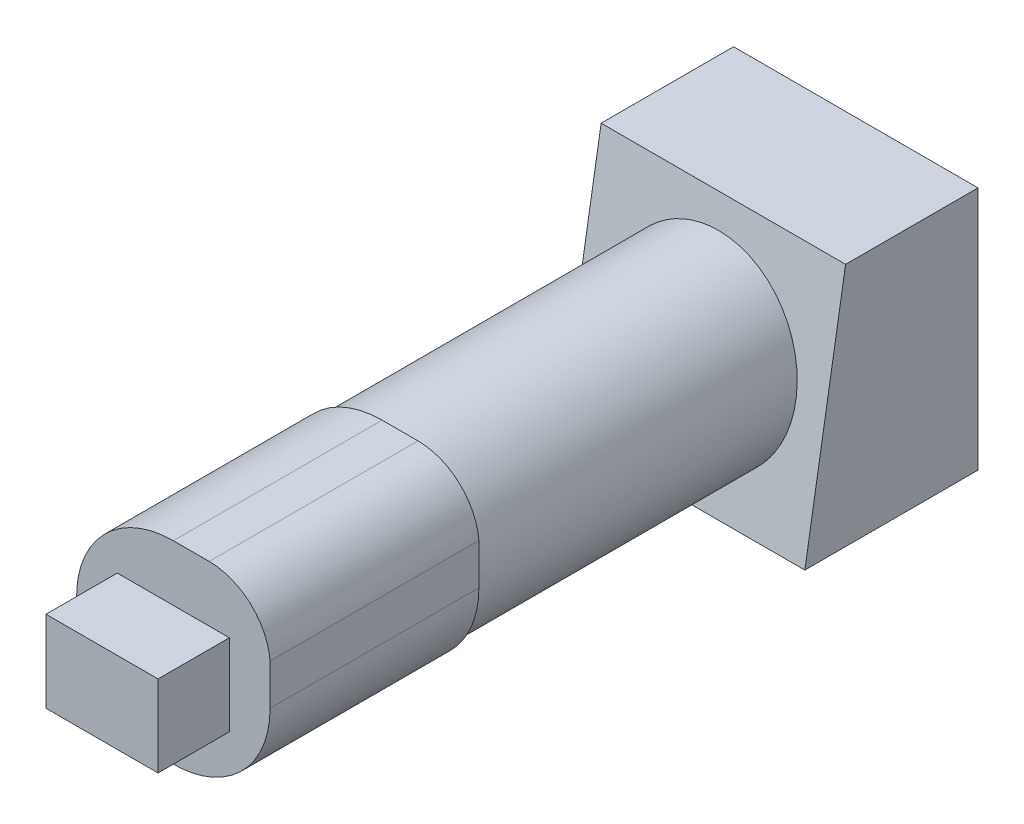
ISO-10303-21;
HEADER;
FILE_DESCRIPTION(('STEP AP214'),'2;1');
FILE_NAME('part.step','',(''),(''),'','','');
FILE_SCHEMA(('AUTOMOTIVE_DESIGN { 1 0 10303 214 1 1 1 1 }'));
ENDSEC;
DATA;
#1=APPLICATION_CONTEXT('core data for automotive mechanical design processes');
#2=APPLICATION_PROTOCOL_DEFINITION('international standard','automotive_design',2000,#1);
#3=PRODUCT_CONTEXT('',#1,'mechanical');
#4=PRODUCT('Part','Part','',(#3));
#5=PRODUCT_RELATED_PRODUCT_CATEGORY('part','',(#4));
#6=PRODUCT_DEFINITION_FORMATION('','',#4);
#7=PRODUCT_DEFINITION_CONTEXT('part definition',#1,'design');
#8=PRODUCT_DEFINITION('design','',#6,#7);
#9=PRODUCT_DEFINITION_SHAPE('','',#8);
#10=(LENGTH_UNIT() NAMED_UNIT(*) SI_UNIT(.MILLI.,.METRE.));
#11=(NAMED_UNIT(*) PLANE_ANGLE_UNIT() SI_UNIT($,.RADIAN.));
#12=(NAMED_UNIT(*) SI_UNIT($,.STERADIAN.) SOLID_ANGLE_UNIT());
#13=UNCERTAINTY_MEASURE_WITH_UNIT(LENGTH_MEASURE(1.E-05),#10,'distance_accuracy_value','');
#14=(GEOMETRIC_REPRESENTATION_CONTEXT(3) GLOBAL_UNCERTAINTY_ASSIGNED_CONTEXT((#13)) GLOBAL_UNIT_ASSIGNED_CONTEXT((#10,
#11,#12)) REPRESENTATION_CONTEXT('',''));
#15=CARTESIAN_POINT('',(0.,0.,0.));
#16=DIRECTION('',(0.,0.,1.));
#17=DIRECTION('',(1.,0.,0.));
#18=AXIS2_PLACEMENT_3D('',#15,#16,#17);
#19=CARTESIAN_POINT('',(12.,24.,8.5));
#20=DIRECTION('',(-1.,0.,0.));
#21=DIRECTION('',(0.,0.,1.));
#22=AXIS2_PLACEMENT_3D('',#19,#20,#21);
#23=PLANE('',#22);
#24=DIRECTION('',(0.,0.,-1.));
#25=VECTOR('',#24,1.);
#26=CARTESIAN_POINT('',(12.,24.,8.5));
#27=LINE('',#26,#25);
#28=CARTESIAN_POINT('',(12.,24.,4.50013871511284));
#29=VERTEX_POINT('',#28);
#30=CARTESIAN_POINT('',(12.,24.,-8.5));
#31=VERTEX_POINT('',#30);
#32=EDGE_CURVE('E190',#29,#31,#27,.T.);
#33=ORIENTED_EDGE('',*,*,#32,.F.);
#34=DIRECTION('',(0.,0.9863948483292,-0.164393440226838));
#35=VECTOR('',#34,1.);
#36=CARTESIAN_POINT('',(12.,0.,8.5));
#37=LINE('',#36,#35);
#38=CARTESIAN_POINT('',(12.,0.,8.5));
#39=VERTEX_POINT('',#38);
#40=EDGE_CURVE('E185',#39,#29,#37,.T.);
#41=ORIENTED_EDGE('',*,*,#40,.F.);
#42=DIRECTION('',(0.,0.,-1.));
#43=VECTOR('',#42,1.);
#44=CARTESIAN_POINT('',(12.,0.,8.5));
#45=LINE('',#44,#43);
#46=CARTESIAN_POINT('',(12.,0.,-8.5));
#47=VERTEX_POINT('',#46);
#48=EDGE_CURVE('E189',#39,#47,#45,.T.);
#49=ORIENTED_EDGE('',*,*,#48,.T.);
#50=DIRECTION('',(0.,-1.,0.));
#51=VECTOR('',#50,1.);
#52=CARTESIAN_POINT('',(12.,24.,-8.5));
#53=LINE('',#52,#51);
#54=EDGE_CURVE('E11',#31,#47,#53,.T.);
#55=ORIENTED_EDGE('',*,*,#54,.F.);
#56=EDGE_LOOP('',(#33,#41,#49,#55));
#57=FACE_BOUND('',#56,.T.);
#58=ADVANCED_FACE('F34',(#57),#23,.F.);
#59=CARTESIAN_POINT('',(-12.,24.,-8.5));
#60=DIRECTION('',(0.,0.,1.));
#61=DIRECTION('',(1.,0.,0.));
#62=AXIS2_PLACEMENT_3D('',#59,#60,#61);
#63=PLANE('',#62);
#64=DIRECTION('',(-1.,0.,0.));
#65=VECTOR('',#64,1.);
#66=CARTESIAN_POINT('',(-12.,0.,-8.5));
#67=LINE('',#66,#65);
#68=CARTESIAN_POINT('',(-12.,0.,-8.5));
#69=VERTEX_POINT('',#68);
#70=EDGE_CURVE('E200',#47,#69,#67,.T.);
#71=ORIENTED_EDGE('',*,*,#70,.T.);
#72=DIRECTION('',(0.,-1.,0.));
#73=VECTOR('',#72,1.);
#74=CARTESIAN_POINT('',(-12.,24.,-8.5));
#75=LINE('',#74,#73);
#76=CARTESIAN_POINT('',(-12.,24.,-8.5));
#77=VERTEX_POINT('',#76);
#78=EDGE_CURVE('E42',#77,#69,#75,.T.);
#79=ORIENTED_EDGE('',*,*,#78,.F.);
#80=DIRECTION('',(-1.,0.,0.));
#81=VECTOR('',#80,1.);
#82=CARTESIAN_POINT('',(-12.,24.,-8.5));
#83=LINE('',#82,#81);
#84=EDGE_CURVE('E192',#31,#77,#83,.T.);
#85=ORIENTED_EDGE('',*,*,#84,.F.);
#86=ORIENTED_EDGE('',*,*,#54,.T.);
#87=EDGE_LOOP('',(#71,#79,#85,#86));
#88=FACE_BOUND('',#87,.T.);
#89=ADVANCED_FACE('F226',(#88),#63,.F.);
#90=CARTESIAN_POINT('',(-12.,24.,8.5));
#91=DIRECTION('',(1.,0.,0.));
#92=DIRECTION('',(0.,0.,-1.));
#93=AXIS2_PLACEMENT_3D('',#90,#91,#92);
#94=PLANE('',#93);
#95=DIRECTION('',(0.,0.,1.));
#96=VECTOR('',#95,1.);
#97=CARTESIAN_POINT('',(-12.,0.,8.5));
#98=LINE('',#97,#96);
#99=CARTESIAN_POINT('',(-12.,0.,8.5));
#100=VERTEX_POINT('',#99);
#101=EDGE_CURVE('E202',#69,#100,#98,.T.);
#102=ORIENTED_EDGE('',*,*,#101,.T.);
#103=DIRECTION('',(0.,0.9863948483292,-0.164393440226838));
#104=VECTOR('',#103,1.);
#105=CARTESIAN_POINT('',(-12.,0.,8.5));
#106=LINE('',#105,#104);
#107=CARTESIAN_POINT('',(-12.,24.,4.50013871511284));
#108=VERTEX_POINT('',#107);
#109=EDGE_CURVE('E181',#100,#108,#106,.T.);
#110=ORIENTED_EDGE('',*,*,#109,.T.);
#111=DIRECTION('',(0.,0.,1.));
#112=VECTOR('',#111,1.);
#113=CARTESIAN_POINT('',(-12.,24.,8.5));
#114=LINE('',#113,#112);
#115=EDGE_CURVE('E195',#77,#108,#114,.T.);
#116=ORIENTED_EDGE('',*,*,#115,.F.);
#117=ORIENTED_EDGE('',*,*,#78,.T.);
#118=EDGE_LOOP('',(#102,#110,#116,#117));
#119=FACE_BOUND('',#118,.T.);
#120=ADVANCED_FACE('F211',(#119),#94,.F.);
#121=CARTESIAN_POINT('',(0.,24.,0.));
#122=DIRECTION('',(0.,-1.,0.));
#123=DIRECTION('',(0.,0.,-1.));
#124=AXIS2_PLACEMENT_3D('',#121,#122,#123);
#125=PLANE('',#124);
#126=ORIENTED_EDGE('',*,*,#115,.T.);
#127=DIRECTION('',(1.,0.,0.));
#128=VECTOR('',#127,1.);
#129=CARTESIAN_POINT('',(-12.,24.,4.50013871511284));
#130=LINE('',#129,#128);
#131=EDGE_CURVE('E184',#108,#29,#130,.T.);
#132=ORIENTED_EDGE('',*,*,#131,.T.);
#133=ORIENTED_EDGE('',*,*,#32,.T.);
#134=ORIENTED_EDGE('',*,*,#84,.T.);
#135=EDGE_LOOP('',(#126,#132,#133,#134));
#136=FACE_BOUND('',#135,.T.);
#137=ADVANCED_FACE('F225',(#136),#125,.F.);
#138=CARTESIAN_POINT('',(0.,0.,0.));
#139=DIRECTION('',(0.,-1.,0.));
#140=DIRECTION('',(0.,0.,-1.));
#141=AXIS2_PLACEMENT_3D('',#138,#139,#140);
#142=PLANE('',#141);
#143=CARTESIAN_POINT('',(-4.99999999999999,0.,3.5));
#144=DIRECTION('',(0.,-1.,0.));
#145=DIRECTION('',(0.,0.,-1.));
#146=AXIS2_PLACEMENT_3D('',#143,#144,#145);
#147=CIRCLE('',#146,2.05);
#148=CARTESIAN_POINT('',(-4.99999999999999,0.,1.45));
#149=VERTEX_POINT('',#148);
#150=EDGE_CURVE('E303',#149,#149,#147,.T.);
#151=ORIENTED_EDGE('',*,*,#150,.F.);
#152=EDGE_LOOP('',(#151));
#153=FACE_BOUND('',#152,.T.);
#154=CARTESIAN_POINT('',(5.00000000000001,0.,3.5));
#155=DIRECTION('',(0.,-1.,0.));
#156=DIRECTION('',(0.,0.,-1.));
#157=AXIS2_PLACEMENT_3D('',#154,#155,#156);
#158=CIRCLE('',#157,2.05);
#159=CARTESIAN_POINT('',(5.00000000000001,0.,1.45));
#160=VERTEX_POINT('',#159);
#161=EDGE_CURVE('E313',#160,#160,#158,.T.);
#162=ORIENTED_EDGE('',*,*,#161,.F.);
#163=EDGE_LOOP('',(#162));
#164=FACE_BOUND('',#163,.T.);
#165=ORIENTED_EDGE('',*,*,#48,.F.);
#166=DIRECTION('',(1.,0.,0.));
#167=VECTOR('',#166,1.);
#168=CARTESIAN_POINT('',(-12.,0.,8.5));
#169=LINE('',#168,#167);
#170=EDGE_CURVE('E193',#100,#39,#169,.T.);
#171=ORIENTED_EDGE('',*,*,#170,.F.);
#172=ORIENTED_EDGE('',*,*,#101,.F.);
#173=ORIENTED_EDGE('',*,*,#70,.F.);
#174=EDGE_LOOP('',(#165,#171,#172,#173));
#175=FACE_BOUND('',#174,.T.);
#176=ADVANCED_FACE('F217',(#153,#164,#175),#142,.T.);
#177=CARTESIAN_POINT('',(-12.,0.,8.5));
#178=DIRECTION('',(0.,-0.164393440226838,-0.9863948483292));
#179=DIRECTION('',(0.,0.9863948483292,-0.164393440226838));
#180=AXIS2_PLACEMENT_3D('',#177,#178,#179);
#181=PLANE('',#180);
#182=CARTESIAN_POINT('',(0.,12.,6.50006935755642));
#183=DIRECTION('',(0.,-0.164393440226838,-0.9863948483292));
#184=DIRECTION('',(0.,0.9863948483292,-0.164393440226838));
#185=AXIS2_PLACEMENT_3D('',#182,#183,#184);
#186=ELLIPSE('',#185,9.25085934446671,9.125);
#187=CARTESIAN_POINT('',(0.,21.125,4.97928876486495));
#188=VERTEX_POINT('',#187);
#189=EDGE_CURVE('E37',#188,#188,#186,.T.);
#190=ORIENTED_EDGE('',*,*,#189,.T.);
#191=EDGE_LOOP('',(#190));
#192=FACE_BOUND('',#191,.T.);
#193=ORIENTED_EDGE('',*,*,#40,.T.);
#194=ORIENTED_EDGE('',*,*,#131,.F.);
#195=ORIENTED_EDGE('',*,*,#109,.F.);
#196=ORIENTED_EDGE('',*,*,#170,.T.);
#197=EDGE_LOOP('',(#193,#194,#195,#196));
#198=FACE_BOUND('',#197,.T.);
#199=ADVANCED_FACE('F220',(#192,#198),#181,.F.);
#200=CARTESIAN_POINT('',(0.,12.,38.0001387151128));
#201=DIRECTION('',(0.,0.,-1.));
#202=DIRECTION('',(-1.,0.,0.));
#203=AXIS2_PLACEMENT_3D('',#200,#201,#202);
#204=CYLINDRICAL_SURFACE('',#203,9.125);
#205=CARTESIAN_POINT('',(0.,12.,38.0001387151128));
#206=DIRECTION('',(0.,0.,-1.));
#207=DIRECTION('',(-1.,0.,0.));
#208=AXIS2_PLACEMENT_3D('',#205,#206,#207);
#209=CIRCLE('',#208,9.125);
#210=CARTESIAN_POINT('',(-9.12499999999999,12.,38.0001387151128));
#211=VERTEX_POINT('',#210);
#212=EDGE_CURVE('E178',#211,#211,#209,.T.);
#213=ORIENTED_EDGE('',*,*,#212,.T.);
#214=EDGE_LOOP('',(#213));
#215=FACE_BOUND('',#214,.T.);
#216=ORIENTED_EDGE('',*,*,#189,.F.);
#217=EDGE_LOOP('',(#216));
#218=FACE_BOUND('',#217,.T.);
#219=ADVANCED_FACE('F241',(#215,#218),#204,.T.);
#220=CARTESIAN_POINT('',(0.,12.,58.5001387151128));
#221=DIRECTION('',(0.,0.,-1.));
#222=DIRECTION('',(-1.,0.,0.));
#223=AXIS2_PLACEMENT_3D('',#220,#221,#222);
#224=CYLINDRICAL_SURFACE('',#223,9.5);
#225=CARTESIAN_POINT('',(0.,12.,38.0001387151128));
#226=DIRECTION('',(0.,0.,1.));
#227=DIRECTION('',(1.,0.,0.));
#228=AXIS2_PLACEMENT_3D('',#225,#226,#227);
#229=CIRCLE('',#228,9.5);
#230=CARTESIAN_POINT('',(0.,21.5,38.0001387151128));
#231=VERTEX_POINT('',#230);
#232=CARTESIAN_POINT('',(9.50000000000001,12.,38.0001387151128));
#233=VERTEX_POINT('',#232);
#234=EDGE_CURVE('E143',#231,#233,#229,.T.);
#235=ORIENTED_EDGE('',*,*,#234,.T.);
#236=DIRECTION('',(0.,0.,-1.));
#237=VECTOR('',#236,1.);
#238=CARTESIAN_POINT('',(9.50000000000001,12.,58.5001387151128));
#239=LINE('',#238,#237);
#240=CARTESIAN_POINT('',(9.50000000000001,12.,58.5001387151128));
#241=VERTEX_POINT('',#240);
#242=EDGE_CURVE('E175',#241,#233,#239,.T.);
#243=ORIENTED_EDGE('',*,*,#242,.F.);
#244=CARTESIAN_POINT('',(0.,12.,58.5001387151128));
#245=DIRECTION('',(0.,0.,1.));
#246=DIRECTION('',(1.,0.,0.));
#247=AXIS2_PLACEMENT_3D('',#244,#245,#246);
#248=CIRCLE('',#247,9.5);
#249=CARTESIAN_POINT('',(0.,21.5,58.5001387151128));
#250=VERTEX_POINT('',#249);
#251=EDGE_CURVE('E152',#250,#241,#248,.T.);
#252=ORIENTED_EDGE('',*,*,#251,.F.);
#253=DIRECTION('',(0.,0.,-1.));
#254=VECTOR('',#253,1.);
#255=CARTESIAN_POINT('',(0.,21.5,58.5001387151128));
#256=LINE('',#255,#254);
#257=EDGE_CURVE('E161',#250,#231,#256,.T.);
#258=ORIENTED_EDGE('',*,*,#257,.T.);
#259=EDGE_LOOP('',(#235,#243,#252,#258));
#260=FACE_BOUND('',#259,.T.);
#261=ADVANCED_FACE('F245',(#260),#224,.T.);
#262=CARTESIAN_POINT('',(9.50000000000001,12.,58.5001387151128));
#263=DIRECTION('',(-1.,0.,0.));
#264=DIRECTION('',(0.,0.,1.));
#265=AXIS2_PLACEMENT_3D('',#262,#263,#264);
#266=PLANE('',#265);
#267=DIRECTION('',(0.,1.,0.));
#268=VECTOR('',#267,1.);
#269=CARTESIAN_POINT('',(9.50000000000001,12.,38.0001387151128));
#270=LINE('',#269,#268);
#271=CARTESIAN_POINT('',(9.50000000000001,16.023,38.0001387151128));
#272=VERTEX_POINT('',#271);
#273=EDGE_CURVE('E146',#233,#272,#270,.T.);
#274=ORIENTED_EDGE('',*,*,#273,.T.);
#275=DIRECTION('',(0.,0.,-1.));
#276=VECTOR('',#275,1.);
#277=CARTESIAN_POINT('',(9.50000000000001,16.023,58.5001387151128));
#278=LINE('',#277,#276);
#279=CARTESIAN_POINT('',(9.50000000000001,16.023,58.5001387151128));
#280=VERTEX_POINT('',#279);
#281=EDGE_CURVE('E172',#280,#272,#278,.T.);
#282=ORIENTED_EDGE('',*,*,#281,.F.);
#283=DIRECTION('',(0.,1.,0.));
#284=VECTOR('',#283,1.);
#285=CARTESIAN_POINT('',(9.50000000000001,12.,58.5001387151128));
#286=LINE('',#285,#284);
#287=EDGE_CURVE('E155',#241,#280,#286,.T.);
#288=ORIENTED_EDGE('',*,*,#287,.F.);
#289=ORIENTED_EDGE('',*,*,#242,.T.);
#290=EDGE_LOOP('',(#274,#282,#288,#289));
#291=FACE_BOUND('',#290,.T.);
#292=ADVANCED_FACE('F249',(#291),#266,.F.);
#293=CARTESIAN_POINT('',(3.52283754612609,15.5,58.5001387151128));
#294=DIRECTION('',(0.,0.,-1.));
#295=DIRECTION('',(-1.,0.,0.));
#296=AXIS2_PLACEMENT_3D('',#293,#294,#295);
#297=CYLINDRICAL_SURFACE('',#296,6.);
#298=CARTESIAN_POINT('',(3.52283754612609,15.5,38.0001387151128));
#299=DIRECTION('',(0.,0.,1.));
#300=DIRECTION('',(-1.,0.,0.));
#301=AXIS2_PLACEMENT_3D('',#298,#299,#300);
#302=CIRCLE('',#301,6.);
#303=CARTESIAN_POINT('',(3.52283754612609,21.5,38.0001387151128));
#304=VERTEX_POINT('',#303);
#305=EDGE_CURVE('E164',#272,#304,#302,.T.);
#306=ORIENTED_EDGE('',*,*,#305,.T.);
#307=DIRECTION('',(0.,0.,-1.));
#308=VECTOR('',#307,1.);
#309=CARTESIAN_POINT('',(3.52283754612609,21.5,58.5001387151128));
#310=LINE('',#309,#308);
#311=CARTESIAN_POINT('',(3.52283754612609,21.5,58.5001387151128));
#312=VERTEX_POINT('',#311);
#313=EDGE_CURVE('E169',#312,#304,#310,.T.);
#314=ORIENTED_EDGE('',*,*,#313,.F.);
#315=CARTESIAN_POINT('',(3.52283754612609,15.5,58.5001387151128));
#316=DIRECTION('',(0.,0.,1.));
#317=DIRECTION('',(-1.,0.,0.));
#318=AXIS2_PLACEMENT_3D('',#315,#316,#317);
#319=CIRCLE('',#318,6.);
#320=EDGE_CURVE('E158',#280,#312,#319,.T.);
#321=ORIENTED_EDGE('',*,*,#320,.F.);
#322=ORIENTED_EDGE('',*,*,#281,.T.);
#323=EDGE_LOOP('',(#306,#314,#321,#322));
#324=FACE_BOUND('',#323,.T.);
#325=ADVANCED_FACE('F253',(#324),#297,.T.);
#326=CARTESIAN_POINT('',(0.,21.5,58.5001387151128));
#327=DIRECTION('',(0.,-1.,0.));
#328=DIRECTION('',(0.,0.,-1.));
#329=AXIS2_PLACEMENT_3D('',#326,#327,#328);
#330=PLANE('',#329);
#331=DIRECTION('',(-1.,0.,0.));
#332=VECTOR('',#331,1.);
#333=CARTESIAN_POINT('',(0.,21.5,38.0001387151128));
#334=LINE('',#333,#332);
#335=EDGE_CURVE('E156',#304,#231,#334,.T.);
#336=ORIENTED_EDGE('',*,*,#335,.T.);
#337=ORIENTED_EDGE('',*,*,#257,.F.);
#338=DIRECTION('',(-1.,0.,0.));
#339=VECTOR('',#338,1.);
#340=CARTESIAN_POINT('',(0.,21.5,58.5001387151128));
#341=LINE('',#340,#339);
#342=EDGE_CURVE('E160',#312,#250,#341,.T.);
#343=ORIENTED_EDGE('',*,*,#342,.F.);
#344=ORIENTED_EDGE('',*,*,#313,.T.);
#345=EDGE_LOOP('',(#336,#337,#343,#344));
#346=FACE_BOUND('',#345,.T.);
#347=ADVANCED_FACE('F257',(#346),#330,.F.);
#348=CARTESIAN_POINT('',(0.,12.,58.5001387151128));
#349=DIRECTION('',(0.,0.,1.));
#350=DIRECTION('',(1.,0.,0.));
#351=AXIS2_PLACEMENT_3D('',#348,#349,#350);
#352=PLANE('',#351);
#353=DIRECTION('',(0.,1.,0.));
#354=VECTOR('',#353,1.);
#355=CARTESIAN_POINT('',(5.50000000000001,8.,58.5001387151128));
#356=LINE('',#355,#354);
#357=CARTESIAN_POINT('',(5.50000000000001,8.,58.5001387151128));
#358=VERTEX_POINT('',#357);
#359=CARTESIAN_POINT('',(5.50000000000001,16.,58.5001387151128));
#360=VERTEX_POINT('',#359);
#361=EDGE_CURVE('E49',#358,#360,#356,.T.);
#362=ORIENTED_EDGE('',*,*,#361,.F.);
#363=DIRECTION('',(1.,0.,0.));
#364=VECTOR('',#363,1.);
#365=CARTESIAN_POINT('',(-5.49999999999999,8.,58.5001387151128));
#366=LINE('',#365,#364);
#367=CARTESIAN_POINT('',(-5.49999999999999,8.,58.5001387151128));
#368=VERTEX_POINT('',#367);
#369=EDGE_CURVE('E53',#368,#358,#366,.T.);
#370=ORIENTED_EDGE('',*,*,#369,.F.);
#371=DIRECTION('',(0.,-1.,0.));
#372=VECTOR('',#371,1.);
#373=CARTESIAN_POINT('',(-5.49999999999999,8.,58.5001387151128));
#374=LINE('',#373,#372);
#375=CARTESIAN_POINT('',(-5.49999999999999,16.,58.5001387151128));
#376=VERTEX_POINT('',#375);
#377=EDGE_CURVE('E320',#376,#368,#374,.T.);
#378=ORIENTED_EDGE('',*,*,#377,.F.);
#379=DIRECTION('',(-1.,0.,0.));
#380=VECTOR('',#379,1.);
#381=CARTESIAN_POINT('',(-5.49999999999999,16.,58.5001387151128));
#382=LINE('',#381,#380);
#383=EDGE_CURVE('E305',#360,#376,#382,.T.);
#384=ORIENTED_EDGE('',*,*,#383,.F.);
#385=EDGE_LOOP('',(#362,#370,#378,#384));
#386=FACE_BOUND('',#385,.T.);
#387=ORIENTED_EDGE('',*,*,#251,.T.);
#388=ORIENTED_EDGE('',*,*,#287,.T.);
#389=ORIENTED_EDGE('',*,*,#320,.T.);
#390=ORIENTED_EDGE('',*,*,#342,.T.);
#391=EDGE_LOOP('',(#387,#388,#389,#390));
#392=FACE_BOUND('',#391,.T.);
#393=ADVANCED_FACE('F261',(#386,#392),#352,.T.);
#394=CARTESIAN_POINT('',(0.,12.,38.0001387151128));
#395=DIRECTION('',(0.,0.,1.));
#396=DIRECTION('',(1.,0.,0.));
#397=AXIS2_PLACEMENT_3D('',#394,#395,#396);
#398=PLANE('',#397);
#399=ORIENTED_EDGE('',*,*,#212,.F.);
#400=EDGE_LOOP('',(#399));
#401=FACE_BOUND('',#400,.T.);
#402=ORIENTED_EDGE('',*,*,#234,.F.);
#403=ORIENTED_EDGE('',*,*,#335,.F.);
#404=ORIENTED_EDGE('',*,*,#305,.F.);
#405=ORIENTED_EDGE('',*,*,#273,.F.);
#406=EDGE_LOOP('',(#402,#403,#404,#405));
#407=FACE_BOUND('',#406,.T.);
#408=ADVANCED_FACE('F263',(#401,#407),#398,.F.);
#409=CARTESIAN_POINT('',(5.50000000000001,8.,65.5001387151128));
#410=DIRECTION('',(-1.,0.,0.));
#411=DIRECTION('',(0.,0.,1.));
#412=AXIS2_PLACEMENT_3D('',#409,#410,#411);
#413=PLANE('',#412);
#414=ORIENTED_EDGE('',*,*,#361,.T.);
#415=DIRECTION('',(0.,0.,-1.));
#416=VECTOR('',#415,1.);
#417=CARTESIAN_POINT('',(5.50000000000001,16.,65.5001387151128));
#418=LINE('',#417,#416);
#419=CARTESIAN_POINT('',(5.50000000000001,16.,65.5001387151128));
#420=VERTEX_POINT('',#419);
#421=EDGE_CURVE('E126',#420,#360,#418,.T.);
#422=ORIENTED_EDGE('',*,*,#421,.F.);
#423=DIRECTION('',(0.,1.,0.));
#424=VECTOR('',#423,1.);
#425=CARTESIAN_POINT('',(5.50000000000001,8.,65.5001387151128));
#426=LINE('',#425,#424);
#427=CARTESIAN_POINT('',(5.50000000000001,8.,65.5001387151128));
#428=VERTEX_POINT('',#427);
#429=EDGE_CURVE('E132',#428,#420,#426,.T.);
#430=ORIENTED_EDGE('',*,*,#429,.F.);
#431=DIRECTION('',(0.,0.,-1.));
#432=VECTOR('',#431,1.);
#433=CARTESIAN_POINT('',(5.50000000000001,8.,65.5001387151128));
#434=LINE('',#433,#432);
#435=EDGE_CURVE('E317',#428,#358,#434,.T.);
#436=ORIENTED_EDGE('',*,*,#435,.T.);
#437=EDGE_LOOP('',(#414,#422,#430,#436));
#438=FACE_BOUND('',#437,.T.);
#439=ADVANCED_FACE('F142',(#438),#413,.F.);
#440=CARTESIAN_POINT('',(-5.49999999999999,16.,65.5001387151128));
#441=DIRECTION('',(0.,-1.,0.));
#442=DIRECTION('',(0.,0.,-1.));
#443=AXIS2_PLACEMENT_3D('',#440,#441,#442);
#444=PLANE('',#443);
#445=ORIENTED_EDGE('',*,*,#383,.T.);
#446=DIRECTION('',(0.,0.,-1.));
#447=VECTOR('',#446,1.);
#448=CARTESIAN_POINT('',(-5.49999999999999,16.,65.5001387151128));
#449=LINE('',#448,#447);
#450=CARTESIAN_POINT('',(-5.49999999999999,16.,65.5001387151128));
#451=VERTEX_POINT('',#450);
#452=EDGE_CURVE('E128',#451,#376,#449,.T.);
#453=ORIENTED_EDGE('',*,*,#452,.F.);
#454=DIRECTION('',(-1.,0.,0.));
#455=VECTOR('',#454,1.);
#456=CARTESIAN_POINT('',(-5.49999999999999,16.,65.5001387151128));
#457=LINE('',#456,#455);
#458=EDGE_CURVE('E121',#420,#451,#457,.T.);
#459=ORIENTED_EDGE('',*,*,#458,.F.);
#460=ORIENTED_EDGE('',*,*,#421,.T.);
#461=EDGE_LOOP('',(#445,#453,#459,#460));
#462=FACE_BOUND('',#461,.T.);
#463=ADVANCED_FACE('F124',(#462),#444,.F.);
#464=CARTESIAN_POINT('',(-5.49999999999999,8.,65.5001387151128));
#465=DIRECTION('',(1.,0.,0.));
#466=DIRECTION('',(0.,0.,-1.));
#467=AXIS2_PLACEMENT_3D('',#464,#465,#466);
#468=PLANE('',#467);
#469=ORIENTED_EDGE('',*,*,#377,.T.);
#470=DIRECTION('',(0.,0.,-1.));
#471=VECTOR('',#470,1.);
#472=CARTESIAN_POINT('',(-5.49999999999999,8.,65.5001387151128));
#473=LINE('',#472,#471);
#474=CARTESIAN_POINT('',(-5.49999999999999,8.,65.5001387151128));
#475=VERTEX_POINT('',#474);
#476=EDGE_CURVE('E148',#475,#368,#473,.T.);
#477=ORIENTED_EDGE('',*,*,#476,.F.);
#478=DIRECTION('',(0.,-1.,0.));
#479=VECTOR('',#478,1.);
#480=CARTESIAN_POINT('',(-5.49999999999999,8.,65.5001387151128));
#481=LINE('',#480,#479);
#482=EDGE_CURVE('E131',#451,#475,#481,.T.);
#483=ORIENTED_EDGE('',*,*,#482,.F.);
#484=ORIENTED_EDGE('',*,*,#452,.T.);
#485=EDGE_LOOP('',(#469,#477,#483,#484));
#486=FACE_BOUND('',#485,.T.);
#487=ADVANCED_FACE('F273',(#486),#468,.F.);
#488=CARTESIAN_POINT('',(-5.49999999999999,8.,65.5001387151128));
#489=DIRECTION('',(0.,1.,0.));
#490=DIRECTION('',(0.,0.,1.));
#491=AXIS2_PLACEMENT_3D('',#488,#489,#490);
#492=PLANE('',#491);
#493=ORIENTED_EDGE('',*,*,#369,.T.);
#494=ORIENTED_EDGE('',*,*,#435,.F.);
#495=DIRECTION('',(1.,0.,0.));
#496=VECTOR('',#495,1.);
#497=CARTESIAN_POINT('',(-5.49999999999999,8.,65.5001387151128));
#498=LINE('',#497,#496);
#499=EDGE_CURVE('E137',#475,#428,#498,.T.);
#500=ORIENTED_EDGE('',*,*,#499,.F.);
#501=ORIENTED_EDGE('',*,*,#476,.T.);
#502=EDGE_LOOP('',(#493,#494,#500,#501));
#503=FACE_BOUND('',#502,.T.);
#504=ADVANCED_FACE('F276',(#503),#492,.F.);
#505=CARTESIAN_POINT('',(0.,0.,65.5001387151128));
#506=DIRECTION('',(0.,0.,-1.));
#507=DIRECTION('',(-1.,0.,0.));
#508=AXIS2_PLACEMENT_3D('',#505,#506,#507);
#509=PLANE('',#508);
#510=ORIENTED_EDGE('',*,*,#429,.T.);
#511=ORIENTED_EDGE('',*,*,#458,.T.);
#512=ORIENTED_EDGE('',*,*,#482,.T.);
#513=ORIENTED_EDGE('',*,*,#499,.T.);
#514=EDGE_LOOP('',(#510,#511,#512,#513));
#515=FACE_BOUND('',#514,.T.);
#516=ADVANCED_FACE('F135',(#515),#509,.F.);
#517=CARTESIAN_POINT('',(5.00000000000001,6.,3.5));
#518=DIRECTION('',(0.,-1.,0.));
#519=DIRECTION('',(0.,0.,-1.));
#520=AXIS2_PLACEMENT_3D('',#517,#518,#519);
#521=CYLINDRICAL_SURFACE('',#520,2.05);
#522=CARTESIAN_POINT('',(5.00000000000001,6.,3.5));
#523=DIRECTION('',(0.,-1.,0.));
#524=DIRECTION('',(0.,0.,-1.));
#525=AXIS2_PLACEMENT_3D('',#522,#523,#524);
#526=CIRCLE('',#525,2.05);
#527=CARTESIAN_POINT('',(5.00000000000001,6.,1.45));
#528=VERTEX_POINT('',#527);
#529=EDGE_CURVE('E308',#528,#528,#526,.T.);
#530=ORIENTED_EDGE('',*,*,#529,.F.);
#531=EDGE_LOOP('',(#530));
#532=FACE_BOUND('',#531,.T.);
#533=ORIENTED_EDGE('',*,*,#161,.T.);
#534=EDGE_LOOP('',(#533));
#535=FACE_BOUND('',#534,.T.);
#536=ADVANCED_FACE('F283',(#532,#535),#521,.F.);
#537=CARTESIAN_POINT('',(5.00000000000001,6.,3.5));
#538=DIRECTION('',(0.,-1.,0.));
#539=DIRECTION('',(0.,0.,-1.));
#540=AXIS2_PLACEMENT_3D('',#537,#538,#539);
#541=PLANE('',#540);
#542=ORIENTED_EDGE('',*,*,#529,.T.);
#543=EDGE_LOOP('',(#542));
#544=FACE_BOUND('',#543,.T.);
#545=ADVANCED_FACE('F286',(#544),#541,.T.);
#546=CARTESIAN_POINT('',(-4.99999999999999,6.,3.5));
#547=DIRECTION('',(0.,-1.,0.));
#548=DIRECTION('',(0.,0.,-1.));
#549=AXIS2_PLACEMENT_3D('',#546,#547,#548);
#550=CYLINDRICAL_SURFACE('',#549,2.05);
#551=CARTESIAN_POINT('',(-4.99999999999999,6.,3.5));
#552=DIRECTION('',(0.,-1.,0.));
#553=DIRECTION('',(0.,0.,-1.));
#554=AXIS2_PLACEMENT_3D('',#551,#552,#553);
#555=CIRCLE('',#554,2.05);
#556=CARTESIAN_POINT('',(-4.99999999999999,6.,1.45));
#557=VERTEX_POINT('',#556);
#558=EDGE_CURVE('E302',#557,#557,#555,.T.);
#559=ORIENTED_EDGE('',*,*,#558,.F.);
#560=EDGE_LOOP('',(#559));
#561=FACE_BOUND('',#560,.T.);
#562=ORIENTED_EDGE('',*,*,#150,.T.);
#563=EDGE_LOOP('',(#562));
#564=FACE_BOUND('',#563,.T.);
#565=ADVANCED_FACE('F290',(#561,#564),#550,.F.);
#566=CARTESIAN_POINT('',(-4.99999999999999,6.,3.5));
#567=DIRECTION('',(0.,-1.,0.));
#568=DIRECTION('',(0.,0.,-1.));
#569=AXIS2_PLACEMENT_3D('',#566,#567,#568);
#570=PLANE('',#569);
#571=ORIENTED_EDGE('',*,*,#558,.T.);
#572=EDGE_LOOP('',(#571));
#573=FACE_BOUND('',#572,.T.);
#574=ADVANCED_FACE('F294',(#573),#570,.T.);
#575=CLOSED_SHELL('',(#58,#89,#120,#137,#176,#199,#219,#261,#292,#325,#347,#393,#408,#439,#463,
#487,#504,#516,#536,#545,#565,#574));
#576=MANIFOLD_SOLID_BREP('B2',#575);
#577=ADVANCED_BREP_SHAPE_REPRESENTATION('',(#18,#576),#14);
#578=SHAPE_DEFINITION_REPRESENTATION(#9,#577);
ENDSEC;
END-ISO-10303-21;
